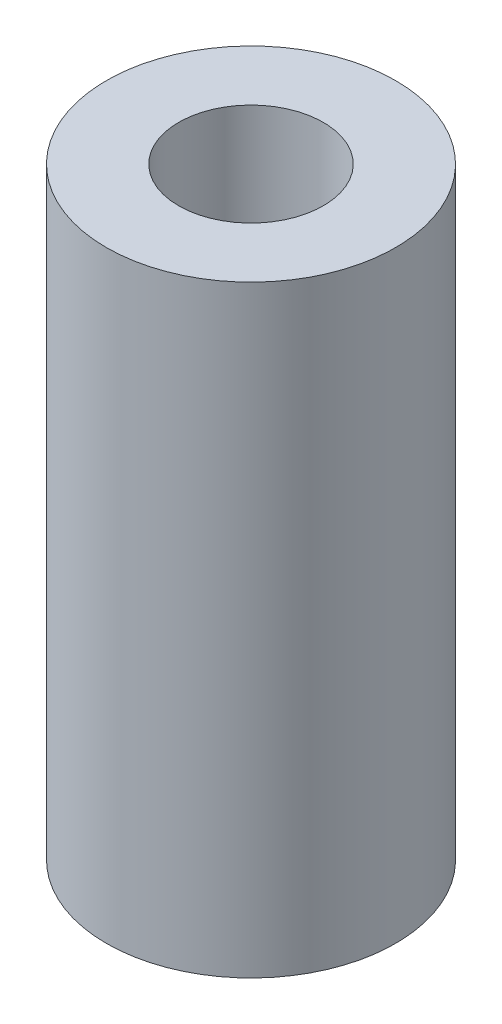
ISO-10303-21;
HEADER;
FILE_DESCRIPTION(('STEP AP214'),'2;1');
FILE_NAME('part.step','',(''),(''),'','','');
FILE_SCHEMA(('AUTOMOTIVE_DESIGN { 1 0 10303 214 1 1 1 1 }'));
ENDSEC;
DATA;
#1=APPLICATION_CONTEXT('core data for automotive mechanical design processes');
#2=APPLICATION_PROTOCOL_DEFINITION('international standard','automotive_design',2000,#1);
#3=PRODUCT_CONTEXT('',#1,'mechanical');
#4=PRODUCT('Part','Part','',(#3));
#5=PRODUCT_RELATED_PRODUCT_CATEGORY('part','',(#4));
#6=PRODUCT_DEFINITION_FORMATION('','',#4);
#7=PRODUCT_DEFINITION_CONTEXT('part definition',#1,'design');
#8=PRODUCT_DEFINITION('design','',#6,#7);
#9=PRODUCT_DEFINITION_SHAPE('','',#8);
#10=(LENGTH_UNIT() NAMED_UNIT(*) SI_UNIT(.MILLI.,.METRE.));
#11=(NAMED_UNIT(*) PLANE_ANGLE_UNIT() SI_UNIT($,.RADIAN.));
#12=(NAMED_UNIT(*) SI_UNIT($,.STERADIAN.) SOLID_ANGLE_UNIT());
#13=UNCERTAINTY_MEASURE_WITH_UNIT(LENGTH_MEASURE(1.E-05),#10,'distance_accuracy_value','');
#14=(GEOMETRIC_REPRESENTATION_CONTEXT(3) GLOBAL_UNCERTAINTY_ASSIGNED_CONTEXT((#13)) GLOBAL_UNIT_ASSIGNED_CONTEXT((#10,
#11,#12)) REPRESENTATION_CONTEXT('',''));
#15=CARTESIAN_POINT('',(0.,0.,0.));
#16=DIRECTION('',(0.,0.,1.));
#17=DIRECTION('',(1.,0.,0.));
#18=AXIS2_PLACEMENT_3D('',#15,#16,#17);
#19=CARTESIAN_POINT('',(0.,12.5,0.));
#20=DIRECTION('',(0.,1.,0.));
#21=DIRECTION('',(0.,0.,1.));
#22=AXIS2_PLACEMENT_3D('',#19,#20,#21);
#23=PLANE('',#22);
#24=CARTESIAN_POINT('',(0.,12.5,0.));
#25=DIRECTION('',(0.,1.,0.));
#26=DIRECTION('',(0.,0.,1.));
#27=AXIS2_PLACEMENT_3D('',#24,#25,#26);
#28=CIRCLE('',#27,3.);
#29=CARTESIAN_POINT('',(0.,12.5,3.));
#30=VERTEX_POINT('',#29);
#31=EDGE_CURVE('E10',#30,#30,#28,.T.);
#32=ORIENTED_EDGE('',*,*,#31,.T.);
#33=EDGE_LOOP('',(#32));
#34=FACE_BOUND('',#33,.T.);
#35=CARTESIAN_POINT('',(0.,12.5,0.));
#36=DIRECTION('',(0.,1.,0.));
#37=DIRECTION('',(0.,0.,1.));
#38=AXIS2_PLACEMENT_3D('',#35,#36,#37);
#39=CIRCLE('',#38,1.5);
#40=CARTESIAN_POINT('',(0.,12.5,1.5));
#41=VERTEX_POINT('',#40);
#42=EDGE_CURVE('E40',#41,#41,#39,.T.);
#43=ORIENTED_EDGE('',*,*,#42,.F.);
#44=EDGE_LOOP('',(#43));
#45=FACE_BOUND('',#44,.T.);
#46=ADVANCED_FACE('F29',(#34,#45),#23,.T.);
#47=CARTESIAN_POINT('',(0.,0.,0.));
#48=DIRECTION('',(0.,1.,0.));
#49=DIRECTION('',(0.,0.,1.));
#50=AXIS2_PLACEMENT_3D('',#47,#48,#49);
#51=PLANE('',#50);
#52=CARTESIAN_POINT('',(0.,0.,0.));
#53=DIRECTION('',(0.,1.,0.));
#54=DIRECTION('',(0.,0.,1.));
#55=AXIS2_PLACEMENT_3D('',#52,#53,#54);
#56=CIRCLE('',#55,3.);
#57=CARTESIAN_POINT('',(0.,0.,3.));
#58=VERTEX_POINT('',#57);
#59=EDGE_CURVE('E33',#58,#58,#56,.T.);
#60=ORIENTED_EDGE('',*,*,#59,.F.);
#61=EDGE_LOOP('',(#60));
#62=FACE_BOUND('',#61,.T.);
#63=CARTESIAN_POINT('',(0.,0.,0.));
#64=DIRECTION('',(0.,1.,0.));
#65=DIRECTION('',(0.,0.,1.));
#66=AXIS2_PLACEMENT_3D('',#63,#64,#65);
#67=CIRCLE('',#66,1.5);
#68=CARTESIAN_POINT('',(0.,0.,1.5));
#69=VERTEX_POINT('',#68);
#70=EDGE_CURVE('E42',#69,#69,#67,.T.);
#71=ORIENTED_EDGE('',*,*,#70,.T.);
#72=EDGE_LOOP('',(#71));
#73=FACE_BOUND('',#72,.T.);
#74=ADVANCED_FACE('F52',(#62,#73),#51,.F.);
#75=CARTESIAN_POINT('',(0.,12.5,0.));
#76=DIRECTION('',(0.,-1.,0.));
#77=DIRECTION('',(0.,0.,-1.));
#78=AXIS2_PLACEMENT_3D('',#75,#76,#77);
#79=CYLINDRICAL_SURFACE('',#78,3.);
#80=ORIENTED_EDGE('',*,*,#31,.F.);
#81=EDGE_LOOP('',(#80));
#82=FACE_BOUND('',#81,.T.);
#83=ORIENTED_EDGE('',*,*,#59,.T.);
#84=EDGE_LOOP('',(#83));
#85=FACE_BOUND('',#84,.T.);
#86=ADVANCED_FACE('F31',(#82,#85),#79,.T.);
#87=CARTESIAN_POINT('',(0.,12.5,0.));
#88=DIRECTION('',(0.,-1.,0.));
#89=DIRECTION('',(0.,0.,-1.));
#90=AXIS2_PLACEMENT_3D('',#87,#88,#89);
#91=CYLINDRICAL_SURFACE('',#90,1.5);
#92=ORIENTED_EDGE('',*,*,#42,.T.);
#93=EDGE_LOOP('',(#92));
#94=FACE_BOUND('',#93,.T.);
#95=ORIENTED_EDGE('',*,*,#70,.F.);
#96=EDGE_LOOP('',(#95));
#97=FACE_BOUND('',#96,.T.);
#98=ADVANCED_FACE('F48',(#94,#97),#91,.F.);
#99=CLOSED_SHELL('',(#46,#74,#86,#98));
#100=MANIFOLD_SOLID_BREP('B2',#99);
#101=ADVANCED_BREP_SHAPE_REPRESENTATION('',(#18,#100),#14);
#102=SHAPE_DEFINITION_REPRESENTATION(#9,#101);
ENDSEC;
END-ISO-10303-21;
